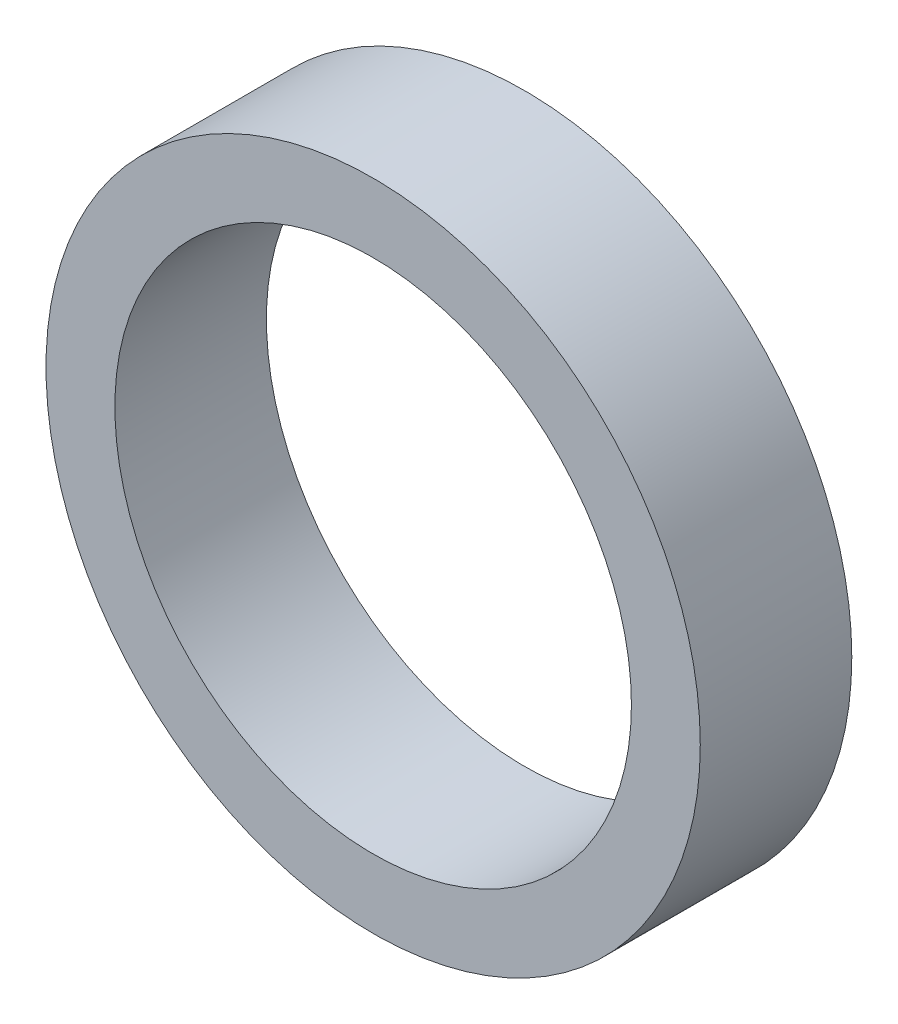
ISO-10303-21;
HEADER;
FILE_DESCRIPTION(('STEP AP214'),'2;1');
FILE_NAME('part.step','',(''),(''),'','','');
FILE_SCHEMA(('AUTOMOTIVE_DESIGN { 1 0 10303 214 1 1 1 1 }'));
ENDSEC;
DATA;
#1=APPLICATION_CONTEXT('core data for automotive mechanical design processes');
#2=APPLICATION_PROTOCOL_DEFINITION('international standard','automotive_design',2000,#1);
#3=PRODUCT_CONTEXT('',#1,'mechanical');
#4=PRODUCT('Part','Part','',(#3));
#5=PRODUCT_RELATED_PRODUCT_CATEGORY('part','',(#4));
#6=PRODUCT_DEFINITION_FORMATION('','',#4);
#7=PRODUCT_DEFINITION_CONTEXT('part definition',#1,'design');
#8=PRODUCT_DEFINITION('design','',#6,#7);
#9=PRODUCT_DEFINITION_SHAPE('','',#8);
#10=(LENGTH_UNIT() NAMED_UNIT(*) SI_UNIT(.MILLI.,.METRE.));
#11=(NAMED_UNIT(*) PLANE_ANGLE_UNIT() SI_UNIT($,.RADIAN.));
#12=(NAMED_UNIT(*) SI_UNIT($,.STERADIAN.) SOLID_ANGLE_UNIT());
#13=UNCERTAINTY_MEASURE_WITH_UNIT(LENGTH_MEASURE(1.E-05),#10,'distance_accuracy_value','');
#14=(GEOMETRIC_REPRESENTATION_CONTEXT(3) GLOBAL_UNCERTAINTY_ASSIGNED_CONTEXT((#13)) GLOBAL_UNIT_ASSIGNED_CONTEXT((#10,
#11,#12)) REPRESENTATION_CONTEXT('',''));
#15=CARTESIAN_POINT('',(0.,0.,0.));
#16=DIRECTION('',(0.,0.,1.));
#17=DIRECTION('',(1.,0.,0.));
#18=AXIS2_PLACEMENT_3D('',#15,#16,#17);
#19=CARTESIAN_POINT('',(0.,0.,5.588));
#20=DIRECTION('',(0.,0.,1.));
#21=DIRECTION('',(1.,0.,0.));
#22=AXIS2_PLACEMENT_3D('',#19,#20,#21);
#23=PLANE('',#22);
#24=CARTESIAN_POINT('',(0.,0.,5.588));
#25=DIRECTION('',(0.,0.,1.));
#26=DIRECTION('',(1.,0.,0.));
#27=AXIS2_PLACEMENT_3D('',#24,#25,#26);
#28=CIRCLE('',#27,12.065);
#29=CARTESIAN_POINT('',(12.065,0.,5.588));
#30=VERTEX_POINT('',#29);
#31=EDGE_CURVE('E10',#30,#30,#28,.T.);
#32=ORIENTED_EDGE('',*,*,#31,.T.);
#33=EDGE_LOOP('',(#32));
#34=FACE_BOUND('',#33,.T.);
#35=CARTESIAN_POINT('',(0.,0.,5.588));
#36=DIRECTION('',(0.,0.,1.));
#37=DIRECTION('',(1.,0.,0.));
#38=AXIS2_PLACEMENT_3D('',#35,#36,#37);
#39=CIRCLE('',#38,9.525);
#40=CARTESIAN_POINT('',(9.525,0.,5.588));
#41=VERTEX_POINT('',#40);
#42=EDGE_CURVE('E42',#41,#41,#39,.T.);
#43=ORIENTED_EDGE('',*,*,#42,.F.);
#44=EDGE_LOOP('',(#43));
#45=FACE_BOUND('',#44,.T.);
#46=ADVANCED_FACE('F31',(#34,#45),#23,.T.);
#47=CARTESIAN_POINT('',(0.,0.,0.));
#48=DIRECTION('',(0.,0.,1.));
#49=DIRECTION('',(1.,0.,0.));
#50=AXIS2_PLACEMENT_3D('',#47,#48,#49);
#51=PLANE('',#50);
#52=CARTESIAN_POINT('',(0.,0.,0.));
#53=DIRECTION('',(0.,0.,1.));
#54=DIRECTION('',(1.,0.,0.));
#55=AXIS2_PLACEMENT_3D('',#52,#53,#54);
#56=CIRCLE('',#55,12.065);
#57=CARTESIAN_POINT('',(12.065,0.,0.));
#58=VERTEX_POINT('',#57);
#59=EDGE_CURVE('E35',#58,#58,#56,.T.);
#60=ORIENTED_EDGE('',*,*,#59,.F.);
#61=EDGE_LOOP('',(#60));
#62=FACE_BOUND('',#61,.T.);
#63=CARTESIAN_POINT('',(0.,0.,0.));
#64=DIRECTION('',(0.,0.,1.));
#65=DIRECTION('',(1.,0.,0.));
#66=AXIS2_PLACEMENT_3D('',#63,#64,#65);
#67=CIRCLE('',#66,9.525);
#68=CARTESIAN_POINT('',(9.525,0.,0.));
#69=VERTEX_POINT('',#68);
#70=EDGE_CURVE('E44',#69,#69,#67,.T.);
#71=ORIENTED_EDGE('',*,*,#70,.T.);
#72=EDGE_LOOP('',(#71));
#73=FACE_BOUND('',#72,.T.);
#74=ADVANCED_FACE('F54',(#62,#73),#51,.F.);
#75=CARTESIAN_POINT('',(0.,0.,5.588));
#76=DIRECTION('',(0.,0.,-1.));
#77=DIRECTION('',(-1.,0.,0.));
#78=AXIS2_PLACEMENT_3D('',#75,#76,#77);
#79=CYLINDRICAL_SURFACE('',#78,12.065);
#80=ORIENTED_EDGE('',*,*,#31,.F.);
#81=EDGE_LOOP('',(#80));
#82=FACE_BOUND('',#81,.T.);
#83=ORIENTED_EDGE('',*,*,#59,.T.);
#84=EDGE_LOOP('',(#83));
#85=FACE_BOUND('',#84,.T.);
#86=ADVANCED_FACE('F33',(#82,#85),#79,.T.);
#87=CARTESIAN_POINT('',(0.,0.,5.588));
#88=DIRECTION('',(0.,0.,-1.));
#89=DIRECTION('',(-1.,0.,0.));
#90=AXIS2_PLACEMENT_3D('',#87,#88,#89);
#91=CYLINDRICAL_SURFACE('',#90,9.525);
#92=ORIENTED_EDGE('',*,*,#42,.T.);
#93=EDGE_LOOP('',(#92));
#94=FACE_BOUND('',#93,.T.);
#95=ORIENTED_EDGE('',*,*,#70,.F.);
#96=EDGE_LOOP('',(#95));
#97=FACE_BOUND('',#96,.T.);
#98=ADVANCED_FACE('F50',(#94,#97),#91,.F.);
#99=CLOSED_SHELL('',(#46,#74,#86,#98));
#100=MANIFOLD_SOLID_BREP('B2',#99);
#101=ADVANCED_BREP_SHAPE_REPRESENTATION('',(#18,#100),#14);
#102=SHAPE_DEFINITION_REPRESENTATION(#9,#101);
ENDSEC;
END-ISO-10303-21;
